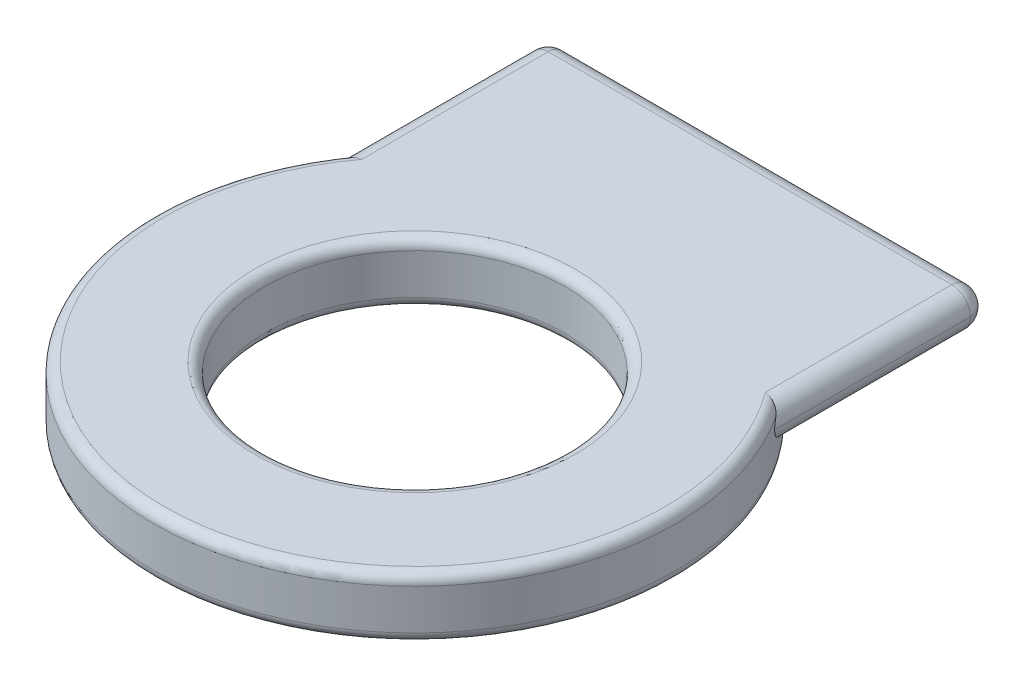
ISO-10303-21;
HEADER;
FILE_DESCRIPTION(('STEP AP214'),'2;1');
FILE_NAME('part.step','',(''),(''),'','','');
FILE_SCHEMA(('AUTOMOTIVE_DESIGN { 1 0 10303 214 1 1 1 1 }'));
ENDSEC;
DATA;
#1=APPLICATION_CONTEXT('core data for automotive mechanical design processes');
#2=APPLICATION_PROTOCOL_DEFINITION('international standard','automotive_design',2000,#1);
#3=PRODUCT_CONTEXT('',#1,'mechanical');
#4=PRODUCT('Part','Part','',(#3));
#5=PRODUCT_RELATED_PRODUCT_CATEGORY('part','',(#4));
#6=PRODUCT_DEFINITION_FORMATION('','',#4);
#7=PRODUCT_DEFINITION_CONTEXT('part definition',#1,'design');
#8=PRODUCT_DEFINITION('design','',#6,#7);
#9=PRODUCT_DEFINITION_SHAPE('','',#8);
#10=(LENGTH_UNIT() NAMED_UNIT(*) SI_UNIT(.MILLI.,.METRE.));
#11=(NAMED_UNIT(*) PLANE_ANGLE_UNIT() SI_UNIT($,.RADIAN.));
#12=(NAMED_UNIT(*) SI_UNIT($,.STERADIAN.) SOLID_ANGLE_UNIT());
#13=UNCERTAINTY_MEASURE_WITH_UNIT(LENGTH_MEASURE(1.E-05),#10,'distance_accuracy_value','');
#14=(GEOMETRIC_REPRESENTATION_CONTEXT(3) GLOBAL_UNCERTAINTY_ASSIGNED_CONTEXT((#13)) GLOBAL_UNIT_ASSIGNED_CONTEXT((#10,
#11,#12)) REPRESENTATION_CONTEXT('',''));
#15=CARTESIAN_POINT('',(0.,0.,0.));
#16=DIRECTION('',(0.,0.,1.));
#17=DIRECTION('',(1.,0.,0.));
#18=AXIS2_PLACEMENT_3D('',#15,#16,#17);
#19=CARTESIAN_POINT('',(0.,7.35,0.));
#20=DIRECTION('',(0.,-1.,0.));
#21=DIRECTION('',(0.,0.,-1.));
#22=AXIS2_PLACEMENT_3D('',#19,#20,#21);
#23=PLANE('',#22);
#24=CARTESIAN_POINT('',(43.61,7.35,0.));
#25=DIRECTION('',(0.,-1.,0.));
#26=DIRECTION('',(0.,0.,-1.));
#27=AXIS2_PLACEMENT_3D('',#24,#25,#26);
#28=CIRCLE('',#27,31.75);
#29=CARTESIAN_POINT('',(43.61,7.35,-31.75));
#30=VERTEX_POINT('',#29);
#31=EDGE_CURVE('E208',#30,#30,#28,.T.);
#32=ORIENTED_EDGE('',*,*,#31,.T.);
#33=EDGE_LOOP('',(#32));
#34=FACE_BOUND('',#33,.T.);
#35=CARTESIAN_POINT('',(43.61,7.35,0.));
#36=DIRECTION('',(0.,-1.,0.));
#37=DIRECTION('',(0.,0.,-1.));
#38=AXIS2_PLACEMENT_3D('',#35,#36,#37);
#39=CIRCLE('',#38,49.61);
#40=CARTESIAN_POINT('',(3.67499999999999,7.35,-29.433787982521));
#41=VERTEX_POINT('',#40);
#42=CARTESIAN_POINT('',(83.545,7.35,-29.4337879825211));
#43=VERTEX_POINT('',#42);
#44=EDGE_CURVE('E258',#41,#43,#39,.F.);
#45=ORIENTED_EDGE('',*,*,#44,.T.);
#46=DIRECTION('',(0.,0.,-1.));
#47=VECTOR('',#46,1.);
#48=CARTESIAN_POINT('',(83.545,7.35,0.));
#49=LINE('',#48,#47);
#50=CARTESIAN_POINT('',(83.545,7.35,-66.325));
#51=VERTEX_POINT('',#50);
#52=EDGE_CURVE('E57',#43,#51,#49,.T.);
#53=ORIENTED_EDGE('',*,*,#52,.T.);
#54=DIRECTION('',(-1.,0.,0.));
#55=VECTOR('',#54,1.);
#56=CARTESIAN_POINT('',(0.,7.35,-66.325));
#57=LINE('',#56,#55);
#58=CARTESIAN_POINT('',(3.67499999999997,7.35,-66.325));
#59=VERTEX_POINT('',#58);
#60=EDGE_CURVE('E278',#51,#59,#57,.T.);
#61=ORIENTED_EDGE('',*,*,#60,.T.);
#62=DIRECTION('',(0.,0.,1.));
#63=VECTOR('',#62,1.);
#64=CARTESIAN_POINT('',(3.675,7.35,0.));
#65=LINE('',#64,#63);
#66=EDGE_CURVE('E65',#59,#41,#65,.T.);
#67=ORIENTED_EDGE('',*,*,#66,.T.);
#68=EDGE_LOOP('',(#45,#53,#61,#67));
#69=FACE_BOUND('',#68,.T.);
#70=ADVANCED_FACE('F41',(#34,#69),#23,.F.);
#71=CARTESIAN_POINT('',(0.,0.,0.));
#72=DIRECTION('',(0.,-1.,0.));
#73=DIRECTION('',(0.,0.,-1.));
#74=AXIS2_PLACEMENT_3D('',#71,#72,#73);
#75=PLANE('',#74);
#76=DIRECTION('',(0.,0.,1.));
#77=VECTOR('',#76,1.);
#78=CARTESIAN_POINT('',(3.67499999999997,0.,-70.));
#79=LINE('',#78,#77);
#80=CARTESIAN_POINT('',(3.67499999999999,0.,-32.692321346151));
#81=VERTEX_POINT('',#80);
#82=CARTESIAN_POINT('',(3.67499999999997,0.,-66.325));
#83=VERTEX_POINT('',#82);
#84=EDGE_CURVE('E127',#81,#83,#79,.F.);
#85=ORIENTED_EDGE('',*,*,#84,.T.);
#86=DIRECTION('',(-1.,0.,0.));
#87=VECTOR('',#86,1.);
#88=CARTESIAN_POINT('',(83.545,0.,-66.325));
#89=LINE('',#88,#87);
#90=CARTESIAN_POINT('',(83.545,0.,-66.325));
#91=VERTEX_POINT('',#90);
#92=EDGE_CURVE('E309',#83,#91,#89,.F.);
#93=ORIENTED_EDGE('',*,*,#92,.T.);
#94=DIRECTION('',(0.,0.,-1.));
#95=VECTOR('',#94,1.);
#96=CARTESIAN_POINT('',(83.545,0.,-27.6));
#97=LINE('',#96,#95);
#98=CARTESIAN_POINT('',(83.545,0.,-32.692321346151));
#99=VERTEX_POINT('',#98);
#100=EDGE_CURVE('E130',#91,#99,#97,.F.);
#101=ORIENTED_EDGE('',*,*,#100,.T.);
#102=CARTESIAN_POINT('',(43.61,0.,0.));
#103=DIRECTION('',(0.,-1.,0.));
#104=DIRECTION('',(0.,0.,-1.));
#105=AXIS2_PLACEMENT_3D('',#102,#103,#104);
#106=CIRCLE('',#105,51.61);
#107=EDGE_CURVE('E114',#81,#99,#106,.T.);
#108=ORIENTED_EDGE('',*,*,#107,.F.);
#109=EDGE_LOOP('',(#85,#93,#101,#108));
#110=FACE_BOUND('',#109,.T.);
#111=ADVANCED_FACE('F126',(#110),#75,.T.);
#112=CARTESIAN_POINT('',(43.61,-4.65,0.));
#113=DIRECTION('',(0.,1.,0.));
#114=DIRECTION('',(0.,0.,1.));
#115=AXIS2_PLACEMENT_3D('',#112,#113,#114);
#116=CYLINDRICAL_SURFACE('',#115,51.61);
#117=CARTESIAN_POINT('',(43.61,-2.65,0.));
#118=DIRECTION('',(0.,1.,0.));
#119=DIRECTION('',(0.,0.,1.));
#120=AXIS2_PLACEMENT_3D('',#117,#118,#119);
#121=CIRCLE('',#120,51.61);
#122=CARTESIAN_POINT('',(43.61,-2.65,51.61));
#123=VERTEX_POINT('',#122);
#124=EDGE_CURVE('E271',#123,#123,#121,.T.);
#125=ORIENTED_EDGE('',*,*,#124,.T.);
#126=EDGE_LOOP('',(#125));
#127=FACE_BOUND('',#126,.T.);
#128=CARTESIAN_POINT('',(87.22,3.675,-27.6));
#129=CARTESIAN_POINT('',(87.2200120697274,3.73447058799168,-27.5999793407501));
#130=CARTESIAN_POINT('',(87.218556809487,3.7939277267955,-27.6022803186823));
#131=CARTESIAN_POINT('',(87.2128056210447,3.91229933152256,-27.6113653047313));
#132=CARTESIAN_POINT('',(87.2085126739399,3.97121430122931,-27.6181446081936));
#133=CARTESIAN_POINT('',(87.1972389785271,4.08750145547175,-27.6359331503886));
#134=CARTESIAN_POINT('',(87.1902867960608,4.14488332951717,-27.6468974309995));
#135=CARTESIAN_POINT('',(87.1738550365268,4.25837855794498,-27.6727821077687));
#136=CARTESIAN_POINT('',(87.1643746744983,4.31449151246753,-27.6877037326134));
#137=CARTESIAN_POINT('',(87.1273213842497,4.50688027331255,-27.7459414080385));
#138=CARTESIAN_POINT('',(87.0936953669759,4.6392486954479,-27.7986631399961));
#139=CARTESIAN_POINT('',(87.01504809175,4.89243449623341,-27.9213032975344));
#140=CARTESIAN_POINT('',(86.9699763162241,5.0131973067111,-27.9912979198964));
#141=CARTESIAN_POINT('',(86.8826484124497,5.21608170471932,-28.1260537318889));
#142=CARTESIAN_POINT('',(86.8421460567324,5.30068623596741,-28.1882901979503));
#143=CARTESIAN_POINT('',(86.7569522734654,5.46312965480362,-28.3185215300211));
#144=CARTESIAN_POINT('',(86.7122585299747,5.54096475563591,-28.386519577552));
#145=CARTESIAN_POINT('',(86.6193718175866,5.69034309299091,-28.527059811735));
#146=CARTESIAN_POINT('',(86.5711746472329,5.76187853964751,-28.5996074396383));
#147=CARTESIAN_POINT('',(86.4718583278312,5.89902605179465,-28.7482382999627));
#148=CARTESIAN_POINT('',(86.4207381153155,5.96463593875168,-28.8243228172758));
#149=CARTESIAN_POINT('',(86.2788117330235,6.13497963625819,-29.0342920338063));
#150=CARTESIAN_POINT('',(86.1855978771221,6.23441807257464,-29.1708611999369));
#151=CARTESIAN_POINT('',(85.9933286247488,6.41891362274059,-29.4495209871749));
#152=CARTESIAN_POINT('',(85.8942692705971,6.50396083881976,-29.5916153263626));
#153=CARTESIAN_POINT('',(85.6910623357859,6.66106227478908,-29.8798839242408));
#154=CARTESIAN_POINT('',(85.5869030778314,6.73308471661691,-30.0260671828873));
#155=CARTESIAN_POINT('',(85.3744013910541,6.86475504703722,-30.3209486990939));
#156=CARTESIAN_POINT('',(85.266058219993,6.92440072788308,-30.4696474002471));
#157=CARTESIAN_POINT('',(85.0288955191624,7.04006241532003,-30.7914435172894));
#158=CARTESIAN_POINT('',(84.8994758237081,7.09413286651806,-30.9647988577494));
#159=CARTESIAN_POINT('',(84.6364536872602,7.18695138060348,-31.3124533998675));
#160=CARTESIAN_POINT('',(84.5028505675109,7.22569694299828,-31.4867527508563));
#161=CARTESIAN_POINT('',(84.2334397841474,7.28755861186809,-31.8335663630081));
#162=CARTESIAN_POINT('',(84.0976681904939,7.31082915337742,-32.0060808111148));
#163=CARTESIAN_POINT('',(83.8918940847401,7.33424188472679,-32.2641166816434));
#164=CARTESIAN_POINT('',(83.822955792505,7.34013060295551,-32.349998843004));
#165=CARTESIAN_POINT('',(83.6844389138072,7.34800823864795,-32.5214328605851));
#166=CARTESIAN_POINT('',(83.6148602898839,7.34999692647697,-32.6069846970601));
#167=CARTESIAN_POINT('',(83.545,7.35,-32.692321346151));
#168=B_SPLINE_CURVE_WITH_KNOTS('',3,(#128,#129,#130,#131,#132,#133,#134,#135,#136,#137,#138,
#139,#140,#141,#142,#143,#144,#145,#146,#147,#148,#149,#150,#151,#152,#153,#154,#155,#156,#157,
#158,#159,#160,#161,#162,#163,#164,#165,#166,#167),.UNSPECIFIED.,.F.,.F.,(4,2,2,2,2,2,2,2,2,2,2,
2,2,2,2,2,2,2,2,4),(0.,0.178327623345856,0.356468203913899,0.53274660494184,0.709079801544966,
1.14564245880431,1.58416649635373,1.92141310778793,2.25884717443795,2.59669280350635,
2.93466214023832,3.51258605357865,4.09090584103518,4.67061812693129,5.25043373224296,
5.91880120675938,6.58727769082131,7.24897869854275,7.57977379849645,7.91058837515793),.UNSPECIFIED.);
#169=CARTESIAN_POINT('',(87.22,3.675,-27.6));
#170=VERTEX_POINT('',#169);
#171=CARTESIAN_POINT('',(86.8160854467592,5.35,-28.2281115267625));
#172=VERTEX_POINT('',#171);
#173=EDGE_CURVE('E178',#170,#172,#168,.T.);
#174=ORIENTED_EDGE('',*,*,#173,.T.);
#175=CARTESIAN_POINT('',(43.61,5.35,0.));
#176=DIRECTION('',(0.,-1.,0.));
#177=DIRECTION('',(0.,0.,-1.));
#178=AXIS2_PLACEMENT_3D('',#175,#176,#177);
#179=CIRCLE('',#178,51.61);
#180=CARTESIAN_POINT('',(0.403914553240769,5.35000000000001,-28.2281115267625));
#181=VERTEX_POINT('',#180);
#182=EDGE_CURVE('E275',#172,#181,#179,.T.);
#183=ORIENTED_EDGE('',*,*,#182,.T.);
#184=CARTESIAN_POINT('',(3.67499999999999,7.35,-32.692321346151));
#185=CARTESIAN_POINT('',(3.59227382574307,7.3499939535197,-32.5912689715995));
#186=CARTESIAN_POINT('',(3.50994538376433,7.34720722765317,-32.4899176345258));
#187=CARTESIAN_POINT('',(3.34620752456578,7.33618319214363,-32.2867794148593));
#188=CARTESIAN_POINT('',(3.26479805097582,7.32794621869075,-32.1849925595156));
#189=CARTESIAN_POINT('',(3.02197369560021,7.29520606536632,-31.8790214602955));
#190=CARTESIAN_POINT('',(2.86211102916241,7.2626740497858,-31.6744076908517));
#191=CARTESIAN_POINT('',(2.54600026977406,7.17616021901823,-31.2635242349988));
#192=CARTESIAN_POINT('',(2.38980625648028,7.12196125408952,-31.057259159301));
#193=CARTESIAN_POINT('',(2.08383358953764,6.9918433155668,-30.6469407090845));
#194=CARTESIAN_POINT('',(1.93405093997804,6.91593810395137,-30.4428860179685));
#195=CARTESIAN_POINT('',(1.70031947815462,6.77608176243416,-30.1196494402313));
#196=CARTESIAN_POINT('',(1.6139216066415,6.71942076155757,-29.9990499444419));
#197=CARTESIAN_POINT('',(1.44425367722334,6.59738245334317,-29.7600971416972));
#198=CARTESIAN_POINT('',(1.36098289697858,6.53200717502454,-29.6417433191687));
#199=CARTESIAN_POINT('',(1.19821946854505,6.39210782869622,-29.4083857581548));
#200=CARTESIAN_POINT('',(1.11871797732054,6.31760681072198,-29.2933744513592));
#201=CARTESIAN_POINT('',(0.963939034385889,6.1585611398075,-29.0675819227294));
#202=CARTESIAN_POINT('',(0.888659992485902,6.0740203058008,-28.9567991135182));
#203=CARTESIAN_POINT('',(0.721774258347508,5.86739212624301,-28.7092400772864));
#204=CARTESIAN_POINT('',(0.631864063188494,5.74156913352338,-28.5743834059908));
#205=CARTESIAN_POINT('',(0.463462497142845,5.4686847752141,-28.3194565515356));
#206=CARTESIAN_POINT('',(0.384960517493055,5.32164339804608,-28.199372646999));
#207=CARTESIAN_POINT('',(0.265580898717908,5.05201534191171,-28.0153823980677));
#208=CARTESIAN_POINT('',(0.220498196525729,4.93543958119461,-27.9454588765151));
#209=CARTESIAN_POINT('',(0.140933883058339,4.69105320708348,-27.8215347564378));
#210=CARTESIAN_POINT('',(0.106407936465446,4.5632925611308,-27.7674676059867));
#211=CARTESIAN_POINT('',(0.0660062926179986,4.37108328965644,-27.7040297010912));
#212=CARTESIAN_POINT('',(0.0548088173734166,4.31039231144217,-27.6864181883946));
#213=CARTESIAN_POINT('',(0.0353644245064966,4.18739488418497,-27.6558051959316));
#214=CARTESIAN_POINT('',(0.0271165421682486,4.12508897049849,-27.6428022088788));
#215=CARTESIAN_POINT('',(0.0137095031947962,3.99852365570931,-27.6216531749139));
#216=CARTESIAN_POINT('',(0.00858975528205809,3.93424963146483,-27.6135691022808));
#217=CARTESIAN_POINT('',(0.00172416212694252,3.80499104970251,-27.6027242667184));
#218=CARTESIAN_POINT('',(-1.71293237627876E-05,3.74000565173865,-27.599970688727));
#219=CARTESIAN_POINT('',(0.,3.675,-27.6));
#220=B_SPLINE_CURVE_WITH_KNOTS('',3,(#184,#185,#186,#187,#188,#189,#190,#191,#192,#193,#194,
#195,#196,#197,#198,#199,#200,#201,#202,#203,#204,#205,#206,#207,#208,#209,#210,#211,#212,#213,
#214,#215,#216,#217,#218,#219),.UNSPECIFIED.,.F.,.F.,(4,2,2,2,2,2,2,2,2,2,2,2,2,2,2,2,2,4),(0.,
0.391717803066449,0.783411445874936,1.56749822702151,2.35964857963435,3.15129781024117,
3.62747625438617,4.10354401890359,4.57843319824753,5.05314231492132,5.66724594229624,
6.28077479522588,6.70915646987603,7.13571353992119,7.32804224004372,7.52030797804853,
7.71494848828474,7.90985117098358),.UNSPECIFIED.);
#221=CARTESIAN_POINT('',(0.,3.675,-27.6));
#222=VERTEX_POINT('',#221);
#223=EDGE_CURVE('E116',#181,#222,#220,.T.);
#224=ORIENTED_EDGE('',*,*,#223,.T.);
#225=CARTESIAN_POINT('',(0.,3.675,-27.6));
#226=CARTESIAN_POINT('',(-1.20697273900106E-05,3.61552941200832,-27.5999793407501));
#227=CARTESIAN_POINT('',(0.00144319051303174,3.5560722732045,-27.6022803186823));
#228=CARTESIAN_POINT('',(0.00719437895523829,3.43770066847744,-27.6113653047313));
#229=CARTESIAN_POINT('',(0.0114873260601244,3.37878569877069,-27.6181446081936));
#230=CARTESIAN_POINT('',(0.0227610214728344,3.26249854452825,-27.6359331503885));
#231=CARTESIAN_POINT('',(0.0297132039391346,3.20511667048283,-27.6468974309994));
#232=CARTESIAN_POINT('',(0.0461449634731991,3.09162144205502,-27.6727821077687));
#233=CARTESIAN_POINT('',(0.0556253255017037,3.03550848753247,-27.6877037326134));
#234=CARTESIAN_POINT('',(0.0926786157502507,2.84311972668745,-27.7459414080385));
#235=CARTESIAN_POINT('',(0.12630463302411,2.7107513045521,-27.7986631399961));
#236=CARTESIAN_POINT('',(0.20495190825003,2.45756550376658,-27.9213032975344));
#237=CARTESIAN_POINT('',(0.25002368377592,2.3368026932889,-27.9912979198963));
#238=CARTESIAN_POINT('',(0.337351587550319,2.13391829528068,-28.1260537318889));
#239=CARTESIAN_POINT('',(0.377853943267574,2.04931376403259,-28.1882901979503));
#240=CARTESIAN_POINT('',(0.463047726534623,1.88687034519637,-28.3185215300211));
#241=CARTESIAN_POINT('',(0.507741470025302,1.80903524436408,-28.3865195775519));
#242=CARTESIAN_POINT('',(0.600628182413353,1.65965690700908,-28.527059811735));
#243=CARTESIAN_POINT('',(0.648825352767092,1.58812146035248,-28.5996074396383));
#244=CARTESIAN_POINT('',(0.748141672168754,1.45097394820534,-28.7482382999627));
#245=CARTESIAN_POINT('',(0.799261884684462,1.38536406124831,-28.8243228172758));
#246=CARTESIAN_POINT('',(0.941188266976504,1.21502036374179,-29.0342920338063));
#247=CARTESIAN_POINT('',(1.03440212287789,1.11558192742534,-29.1708611999369));
#248=CARTESIAN_POINT('',(1.22667137525119,0.931086377259395,-29.4495209871749));
#249=CARTESIAN_POINT('',(1.3257307294029,0.846039161180221,-29.5916153263626));
#250=CARTESIAN_POINT('',(1.52893766421413,0.688937725210902,-29.8798839242409));
#251=CARTESIAN_POINT('',(1.63309692216865,0.616915283383067,-30.0260671828873));
#252=CARTESIAN_POINT('',(1.84559860894587,0.485244952962758,-30.3209486990939));
#253=CARTESIAN_POINT('',(1.95394178000704,0.425599272116901,-30.4696474002471));
#254=CARTESIAN_POINT('',(2.19110448083764,0.309937584679953,-30.7914435172894));
#255=CARTESIAN_POINT('',(2.32052417629193,0.255867133481927,-30.9647988577494));
#256=CARTESIAN_POINT('',(2.58354631273984,0.163048619396511,-31.3124533998676));
#257=CARTESIAN_POINT('',(2.71714943248911,0.124303057001712,-31.4867527508563));
#258=CARTESIAN_POINT('',(2.98656021585262,0.0624413881319125,-31.8335663630081));
#259=CARTESIAN_POINT('',(3.12233180950609,0.0391708466225755,-32.0060808111148));
#260=CARTESIAN_POINT('',(3.32810591525992,0.0157581152732105,-32.2641166816434));
#261=CARTESIAN_POINT('',(3.39704420749496,0.0098693970444903,-32.349998843004));
#262=CARTESIAN_POINT('',(3.53556108619277,0.00199176135205103,-32.5214328605851));
#263=CARTESIAN_POINT('',(3.60513971011609,3.07352303006731E-06,-32.6069846970601));
#264=CARTESIAN_POINT('',(3.67499999999999,0.,-32.692321346151));
#265=B_SPLINE_CURVE_WITH_KNOTS('',3,(#225,#226,#227,#228,#229,#230,#231,#232,#233,#234,#235,
#236,#237,#238,#239,#240,#241,#242,#243,#244,#245,#246,#247,#248,#249,#250,#251,#252,#253,#254,
#255,#256,#257,#258,#259,#260,#261,#262,#263,#264),.UNSPECIFIED.,.F.,.F.,(4,2,2,2,2,2,2,2,2,2,2,
2,2,2,2,2,2,2,2,4),(0.,0.178327623345857,0.356468203913899,0.532746604941839,0.709079801544968,
1.14564245880432,1.58416649635373,1.92141310778794,2.25884717443796,2.59669280350636,
2.93466214023834,3.5125860535787,4.09090584103524,4.67061812693135,5.25043373224302,
5.91880120675942,6.58727769082133,7.24897869854277,7.57977379849646,7.91058837515794),.UNSPECIFIED.);
#266=EDGE_CURVE('E109',#222,#81,#265,.T.);
#267=ORIENTED_EDGE('',*,*,#266,.T.);
#268=ORIENTED_EDGE('',*,*,#107,.T.);
#269=CARTESIAN_POINT('',(83.545,0.,-32.692321346151));
#270=CARTESIAN_POINT('',(83.6277261742569,6.04648029819773E-06,-32.5912689715995));
#271=CARTESIAN_POINT('',(83.7100546162357,0.00279277234682455,-32.4899176345258));
#272=CARTESIAN_POINT('',(83.8737924754342,0.0138168078563718,-32.2867794148593));
#273=CARTESIAN_POINT('',(83.9552019490242,0.0220537813092535,-32.1849925595156));
#274=CARTESIAN_POINT('',(84.1980263043998,0.0547939346336789,-31.8790214602955));
#275=CARTESIAN_POINT('',(84.3578889708376,0.0873259502141974,-31.6744076908517));
#276=CARTESIAN_POINT('',(84.6739997302259,0.173839780981774,-31.2635242349988));
#277=CARTESIAN_POINT('',(84.8301937435197,0.228038745910485,-31.057259159301));
#278=CARTESIAN_POINT('',(85.1361664104624,0.358156684433202,-30.6469407090846));
#279=CARTESIAN_POINT('',(85.285949060022,0.434061896048637,-30.4428860179685));
#280=CARTESIAN_POINT('',(85.5196805218454,0.573918237565846,-30.1196494402313));
#281=CARTESIAN_POINT('',(85.6060783933585,0.630579238442443,-29.9990499444419));
#282=CARTESIAN_POINT('',(85.7757463227767,0.752617546656845,-29.7600971416972));
#283=CARTESIAN_POINT('',(85.8590171030214,0.81799282497548,-29.6417433191687));
#284=CARTESIAN_POINT('',(86.021780531455,0.95789217130379,-29.4083857581548));
#285=CARTESIAN_POINT('',(86.1012820226795,1.03239318927803,-29.2933744513592));
#286=CARTESIAN_POINT('',(86.2560609656141,1.19143886019251,-29.0675819227294));
#287=CARTESIAN_POINT('',(86.3313400075141,1.27597969419922,-28.9567991135182));
#288=CARTESIAN_POINT('',(86.4982257416525,1.48260787375701,-28.7092400772864));
#289=CARTESIAN_POINT('',(86.5881359368115,1.60843086647664,-28.5743834059908));
#290=CARTESIAN_POINT('',(86.7565375028572,1.88131522478591,-28.3194565515356));
#291=CARTESIAN_POINT('',(86.8350394825069,2.02835660195393,-28.199372646999));
#292=CARTESIAN_POINT('',(86.9544191012821,2.2979846580883,-28.0153823980678));
#293=CARTESIAN_POINT('',(86.9995018034742,2.4145604188054,-27.9454588765151));
#294=CARTESIAN_POINT('',(87.0790661169416,2.65894679291652,-27.8215347564378));
#295=CARTESIAN_POINT('',(87.1135920635345,2.7867074388692,-27.7674676059867));
#296=CARTESIAN_POINT('',(87.153993707382,2.97891671034358,-27.7040297010913));
#297=CARTESIAN_POINT('',(87.1651911826266,3.03960768855785,-27.6864181883946));
#298=CARTESIAN_POINT('',(87.1846355754935,3.16260511581504,-27.6558051959316));
#299=CARTESIAN_POINT('',(87.1928834578317,3.22491102950151,-27.6428022088788));
#300=CARTESIAN_POINT('',(87.2062904968052,3.35147634429069,-27.6216531749139));
#301=CARTESIAN_POINT('',(87.2114102447179,3.41575036853517,-27.6135691022808));
#302=CARTESIAN_POINT('',(87.2182758378731,3.54500895029749,-27.6027242667184));
#303=CARTESIAN_POINT('',(87.2200171293238,3.60999434826135,-27.599970688727));
#304=CARTESIAN_POINT('',(87.22,3.675,-27.6));
#305=B_SPLINE_CURVE_WITH_KNOTS('',3,(#269,#270,#271,#272,#273,#274,#275,#276,#277,#278,#279,
#280,#281,#282,#283,#284,#285,#286,#287,#288,#289,#290,#291,#292,#293,#294,#295,#296,#297,#298,
#299,#300,#301,#302,#303,#304),.UNSPECIFIED.,.F.,.F.,(4,2,2,2,2,2,2,2,2,2,2,2,2,2,2,2,2,4),(0.,
0.391717803066445,0.783411445874927,1.56749822702151,2.35964857963435,3.15129781024119,
3.6274762543862,4.10354401890361,4.57843319824756,5.05314231492134,5.66724594229625,
6.28077479522589,6.70915646987603,7.1357135399212,7.32804224004373,7.52030797804853,
7.71494848828474,7.90985117098358),.UNSPECIFIED.);
#306=EDGE_CURVE('E122',#99,#170,#305,.T.);
#307=ORIENTED_EDGE('',*,*,#306,.T.);
#308=EDGE_LOOP('',(#174,#183,#224,#267,#268,#307));
#309=FACE_BOUND('',#308,.T.);
#310=ADVANCED_FACE('F112',(#127,#309),#116,.T.);
#311=CARTESIAN_POINT('',(43.61,-4.65,0.));
#312=DIRECTION('',(0.,1.,0.));
#313=DIRECTION('',(0.,0.,1.));
#314=AXIS2_PLACEMENT_3D('',#311,#312,#313);
#315=PLANE('',#314);
#316=CARTESIAN_POINT('',(43.61,-4.65,0.));
#317=DIRECTION('',(0.,1.,0.));
#318=DIRECTION('',(0.,0.,1.));
#319=AXIS2_PLACEMENT_3D('',#316,#317,#318);
#320=CIRCLE('',#319,31.75);
#321=CARTESIAN_POINT('',(43.61,-4.65,31.75));
#322=VERTEX_POINT('',#321);
#323=EDGE_CURVE('E50',#322,#322,#320,.T.);
#324=ORIENTED_EDGE('',*,*,#323,.T.);
#325=EDGE_LOOP('',(#324));
#326=FACE_BOUND('',#325,.T.);
#327=CARTESIAN_POINT('',(43.61,-4.65,0.));
#328=DIRECTION('',(0.,1.,0.));
#329=DIRECTION('',(0.,0.,1.));
#330=AXIS2_PLACEMENT_3D('',#327,#328,#329);
#331=CIRCLE('',#330,49.61);
#332=CARTESIAN_POINT('',(43.61,-4.65,49.61));
#333=VERTEX_POINT('',#332);
#334=EDGE_CURVE('E265',#333,#333,#331,.F.);
#335=ORIENTED_EDGE('',*,*,#334,.T.);
#336=EDGE_LOOP('',(#335));
#337=FACE_BOUND('',#336,.T.);
#338=ADVANCED_FACE('F164',(#326,#337),#315,.F.);
#339=CARTESIAN_POINT('',(43.61,-4.65,0.));
#340=DIRECTION('',(0.,1.,0.));
#341=DIRECTION('',(0.,0.,1.));
#342=AXIS2_PLACEMENT_3D('',#339,#340,#341);
#343=CYLINDRICAL_SURFACE('',#342,29.75);
#344=CARTESIAN_POINT('',(43.61,-2.65,0.));
#345=DIRECTION('',(0.,1.,0.));
#346=DIRECTION('',(0.,0.,1.));
#347=AXIS2_PLACEMENT_3D('',#344,#345,#346);
#348=CIRCLE('',#347,29.75);
#349=CARTESIAN_POINT('',(43.61,-2.65,29.75));
#350=VERTEX_POINT('',#349);
#351=EDGE_CURVE('E11',#350,#350,#348,.F.);
#352=ORIENTED_EDGE('',*,*,#351,.T.);
#353=EDGE_LOOP('',(#352));
#354=FACE_BOUND('',#353,.T.);
#355=CARTESIAN_POINT('',(43.61,5.35,0.));
#356=DIRECTION('',(0.,-1.,0.));
#357=DIRECTION('',(0.,0.,-1.));
#358=AXIS2_PLACEMENT_3D('',#355,#356,#357);
#359=CIRCLE('',#358,29.75);
#360=CARTESIAN_POINT('',(43.61,5.35,-29.75));
#361=VERTEX_POINT('',#360);
#362=EDGE_CURVE('E261',#361,#361,#359,.F.);
#363=ORIENTED_EDGE('',*,*,#362,.T.);
#364=EDGE_LOOP('',(#363));
#365=FACE_BOUND('',#364,.T.);
#366=ADVANCED_FACE('F166',(#354,#365),#343,.F.);
#367=CARTESIAN_POINT('',(3.675,3.675,0.));
#368=DIRECTION('',(0.,0.,-1.));
#369=DIRECTION('',(-1.,0.,0.));
#370=AXIS2_PLACEMENT_3D('',#367,#368,#369);
#371=CYLINDRICAL_SURFACE('',#370,3.675);
#372=DIRECTION('',(0.,0.,1.));
#373=VECTOR('',#372,1.);
#374=CARTESIAN_POINT('',(0.,3.675,-27.6));
#375=LINE('',#374,#373);
#376=CARTESIAN_POINT('',(0.,3.675,-66.325));
#377=VERTEX_POINT('',#376);
#378=EDGE_CURVE('E133',#377,#222,#375,.T.);
#379=ORIENTED_EDGE('',*,*,#378,.F.);
#380=CARTESIAN_POINT('',(3.67499999999997,3.675,-66.325));
#381=DIRECTION('',(0.,0.,-1.));
#382=DIRECTION('',(-1.,0.,0.));
#383=AXIS2_PLACEMENT_3D('',#380,#381,#382);
#384=CIRCLE('',#383,3.675);
#385=EDGE_CURVE('E137',#377,#83,#384,.F.);
#386=ORIENTED_EDGE('',*,*,#385,.T.);
#387=ORIENTED_EDGE('',*,*,#84,.F.);
#388=ORIENTED_EDGE('',*,*,#266,.F.);
#389=EDGE_LOOP('',(#379,#386,#387,#388));
#390=FACE_BOUND('',#389,.T.);
#391=ADVANCED_FACE('F135',(#390),#371,.T.);
#392=CARTESIAN_POINT('',(3.675,3.675,0.));
#393=DIRECTION('',(0.,0.,1.));
#394=DIRECTION('',(1.,0.,0.));
#395=AXIS2_PLACEMENT_3D('',#392,#393,#394);
#396=CYLINDRICAL_SURFACE('',#395,3.675);
#397=ORIENTED_EDGE('',*,*,#66,.F.);
#398=CARTESIAN_POINT('',(3.67499999999997,3.675,-66.325));
#399=DIRECTION('',(0.,0.,1.));
#400=DIRECTION('',(1.,0.,0.));
#401=AXIS2_PLACEMENT_3D('',#398,#399,#400);
#402=CIRCLE('',#401,3.675);
#403=EDGE_CURVE('E312',#59,#377,#402,.T.);
#404=ORIENTED_EDGE('',*,*,#403,.T.);
#405=ORIENTED_EDGE('',*,*,#378,.T.);
#406=ORIENTED_EDGE('',*,*,#223,.F.);
#407=CARTESIAN_POINT('',(0.403914553240769,5.35,-28.2281115267625));
#408=CARTESIAN_POINT('',(0.435478592487258,5.41166843994323,-28.2764531672922));
#409=CARTESIAN_POINT('',(0.469396614691892,5.47358183887079,-28.3229476207205));
#410=CARTESIAN_POINT('',(0.541990061714706,5.59723542916085,-28.4122945219835));
#411=CARTESIAN_POINT('',(0.580665015896002,5.65897563704115,-28.4551473294038));
#412=CARTESIAN_POINT('',(0.662820510480497,5.78162101645552,-28.5372653731954));
#413=CARTESIAN_POINT('',(0.706300175451741,5.8425263378426,-28.5765312607401));
#414=CARTESIAN_POINT('',(0.798025514889235,5.96287396580632,-28.6515938567353));
#415=CARTESIAN_POINT('',(0.846271579564495,6.0223161521026,-28.6873902806766));
#416=CARTESIAN_POINT('',(0.956758601716215,6.14990614496263,-28.7619533978183));
#417=CARTESIAN_POINT('',(1.01993909937953,6.21763598435031,-28.8000490236448));
#418=CARTESIAN_POINT('',(1.15254979356268,6.34924802238274,-28.8718592028956));
#419=CARTESIAN_POINT('',(1.22198269651554,6.41312853463304,-28.9055718435091));
#420=CARTESIAN_POINT('',(1.36662878350814,6.53612850210965,-28.9689148746798));
#421=CARTESIAN_POINT('',(1.4418396145523,6.59524987556454,-28.9985469134304));
#422=CARTESIAN_POINT('',(1.59758559493438,6.70802191203763,-29.0541157677008));
#423=CARTESIAN_POINT('',(1.67812266346346,6.76167058519128,-29.0800512405072));
#424=CARTESIAN_POINT('',(1.84347041014587,6.86254655135056,-29.128468835783));
#425=CARTESIAN_POINT('',(1.92825565523887,6.90980696348616,-29.1509688544507));
#426=CARTESIAN_POINT('',(2.10187918665131,6.99770745373152,-29.1930784847291));
#427=CARTESIAN_POINT('',(2.19071756855662,7.03834737560565,-29.212688028127));
#428=CARTESIAN_POINT('',(2.37178975313652,7.11256319346225,-29.2494214945307));
#429=CARTESIAN_POINT('',(2.46402342191057,7.14613936766908,-29.2665455154271));
#430=CARTESIAN_POINT('',(2.65118408734162,7.20587480842697,-29.2987165824014));
#431=CARTESIAN_POINT('',(2.74611052968728,7.23203558943299,-29.3137640522531));
#432=CARTESIAN_POINT('',(2.97544065344989,7.28539945647628,-29.3477529542152));
#433=CARTESIAN_POINT('',(3.11080212919512,7.30902997714543,-29.3659243075781));
#434=CARTESIAN_POINT('',(3.38337020195895,7.3409740696313,-29.4001649838825));
#435=CARTESIAN_POINT('',(3.52057304523761,7.34931509588038,-29.4162380263203));
#436=CARTESIAN_POINT('',(3.66350308216853,7.34998654144318,-29.4324836940073));
#437=CARTESIAN_POINT('',(3.66925159894046,7.3500000312925,-29.4331362401001));
#438=CARTESIAN_POINT('',(3.675,7.35,-29.433787982521));
#439=B_SPLINE_CURVE_WITH_KNOTS('',3,(#407,#408,#409,#410,#411,#412,#413,#414,#415,#416,#417,
#418,#419,#420,#421,#422,#423,#424,#425,#426,#427,#428,#429,#430,#431,#432,#433,#434,#435,#436,
#437,#438),.UNSPECIFIED.,.F.,.F.,(4,2,2,2,2,2,2,2,2,2,2,2,2,2,2,4),(0.,0.253377801586797,
0.50673055485196,0.760037222401726,1.01336464452231,1.31344489914542,1.61365567750652,
1.91374484000009,2.21394272837951,2.51251913334062,2.81110258332619,3.10967427061124,
3.40818493622289,3.82311490848506,4.2372990831537,4.25465536305802),.UNSPECIFIED.);
#440=EDGE_CURVE('E207',#181,#41,#439,.T.);
#441=ORIENTED_EDGE('',*,*,#440,.T.);
#442=EDGE_LOOP('',(#397,#404,#405,#406,#441));
#443=FACE_BOUND('',#442,.T.);
#444=ADVANCED_FACE('F157',(#443),#396,.T.);
#445=CARTESIAN_POINT('',(83.545,3.675,0.));
#446=DIRECTION('',(0.,0.,-1.));
#447=DIRECTION('',(-1.,0.,0.));
#448=AXIS2_PLACEMENT_3D('',#445,#446,#447);
#449=CYLINDRICAL_SURFACE('',#448,3.675);
#450=DIRECTION('',(0.,0.,-1.));
#451=VECTOR('',#450,1.);
#452=CARTESIAN_POINT('',(87.22,3.675,0.));
#453=LINE('',#452,#451);
#454=CARTESIAN_POINT('',(87.22,3.675,-66.325));
#455=VERTEX_POINT('',#454);
#456=EDGE_CURVE('E283',#455,#170,#453,.F.);
#457=ORIENTED_EDGE('',*,*,#456,.F.);
#458=CARTESIAN_POINT('',(83.545,3.675,-66.325));
#459=DIRECTION('',(0.,0.,-1.));
#460=DIRECTION('',(-1.,0.,0.));
#461=AXIS2_PLACEMENT_3D('',#458,#459,#460);
#462=CIRCLE('',#461,3.675);
#463=EDGE_CURVE('E320',#455,#51,#462,.F.);
#464=ORIENTED_EDGE('',*,*,#463,.T.);
#465=ORIENTED_EDGE('',*,*,#52,.F.);
#466=CARTESIAN_POINT('',(86.8160854467592,5.35,-28.2281115267625));
#467=CARTESIAN_POINT('',(86.7845214075127,5.41166843994322,-28.2764531672922));
#468=CARTESIAN_POINT('',(86.7506033853081,5.47358183887079,-28.3229476207205));
#469=CARTESIAN_POINT('',(86.6780099382853,5.59723542916084,-28.4122945219835));
#470=CARTESIAN_POINT('',(86.639334984104,5.65897563704114,-28.4551473294038));
#471=CARTESIAN_POINT('',(86.5571794895195,5.78162101645552,-28.5372653731955));
#472=CARTESIAN_POINT('',(86.5136998245483,5.84252633784259,-28.5765312607401));
#473=CARTESIAN_POINT('',(86.4219744851107,5.96287396580631,-28.6515938567353));
#474=CARTESIAN_POINT('',(86.3737284204355,6.0223161521026,-28.6873902806766));
#475=CARTESIAN_POINT('',(86.2632413982838,6.14990614496262,-28.7619533978183));
#476=CARTESIAN_POINT('',(86.2000609006205,6.2176359843503,-28.8000490236448));
#477=CARTESIAN_POINT('',(86.0674502064373,6.34924802238273,-28.8718592028956));
#478=CARTESIAN_POINT('',(85.9980173034844,6.41312853463303,-28.9055718435091));
#479=CARTESIAN_POINT('',(85.8533712164919,6.53612850210964,-28.9689148746798));
#480=CARTESIAN_POINT('',(85.7781603854477,6.59524987556453,-28.9985469134304));
#481=CARTESIAN_POINT('',(85.6224144050656,6.70802191203762,-29.0541157677008));
#482=CARTESIAN_POINT('',(85.5418773365365,6.76167058519127,-29.0800512405072));
#483=CARTESIAN_POINT('',(85.3765295898541,6.86254655135055,-29.1284688357831));
#484=CARTESIAN_POINT('',(85.2917443447611,6.90980696348616,-29.1509688544508));
#485=CARTESIAN_POINT('',(85.1181208133487,6.99770745373152,-29.1930784847291));
#486=CARTESIAN_POINT('',(85.0292824314434,7.03834737560565,-29.212688028127));
#487=CARTESIAN_POINT('',(84.8482102468635,7.11256319346225,-29.2494214945307));
#488=CARTESIAN_POINT('',(84.7559765780894,7.14613936766908,-29.2665455154272));
#489=CARTESIAN_POINT('',(84.5688159126583,7.20587480842698,-29.2987165824014));
#490=CARTESIAN_POINT('',(84.4738894703127,7.232035589433,-29.3137640522531));
#491=CARTESIAN_POINT('',(84.2445593465501,7.28539945647628,-29.3477529542153));
#492=CARTESIAN_POINT('',(84.1091978708048,7.30902997714543,-29.3659243075782));
#493=CARTESIAN_POINT('',(83.836629798041,7.3409740696313,-29.4001649838825));
#494=CARTESIAN_POINT('',(83.6994269547624,7.34931509588038,-29.4162380263202));
#495=CARTESIAN_POINT('',(83.5564969178315,7.34998654144318,-29.4324836940073));
#496=CARTESIAN_POINT('',(83.5507484010595,7.3500000312925,-29.4331362401001));
#497=CARTESIAN_POINT('',(83.545,7.35,-29.4337879825211));
#498=B_SPLINE_CURVE_WITH_KNOTS('',3,(#466,#467,#468,#469,#470,#471,#472,#473,#474,#475,#476,
#477,#478,#479,#480,#481,#482,#483,#484,#485,#486,#487,#488,#489,#490,#491,#492,#493,#494,#495,
#496,#497),.UNSPECIFIED.,.F.,.F.,(4,2,2,2,2,2,2,2,2,2,2,2,2,2,2,4),(0.,0.253377801586795,
0.506730554851964,0.760037222401725,1.01336464452231,1.31344489914541,1.61365567750652,
1.91374484000009,2.21394272837951,2.51251913334062,2.81110258332619,3.10967427061126,
3.40818493622292,3.82311490848506,4.23729908315368,4.25465536305802),.UNSPECIFIED.);
#499=EDGE_CURVE('E199',#43,#172,#498,.F.);
#500=ORIENTED_EDGE('',*,*,#499,.T.);
#501=ORIENTED_EDGE('',*,*,#173,.F.);
#502=EDGE_LOOP('',(#457,#464,#465,#500,#501));
#503=FACE_BOUND('',#502,.T.);
#504=ADVANCED_FACE('F189',(#503),#449,.T.);
#505=CARTESIAN_POINT('',(83.545,3.675,0.));
#506=DIRECTION('',(0.,0.,1.));
#507=DIRECTION('',(1.,0.,0.));
#508=AXIS2_PLACEMENT_3D('',#505,#506,#507);
#509=CYLINDRICAL_SURFACE('',#508,3.675);
#510=ORIENTED_EDGE('',*,*,#100,.F.);
#511=CARTESIAN_POINT('',(83.545,3.675,-66.325));
#512=DIRECTION('',(0.,0.,1.));
#513=DIRECTION('',(1.,0.,0.));
#514=AXIS2_PLACEMENT_3D('',#511,#512,#513);
#515=CIRCLE('',#514,3.675);
#516=EDGE_CURVE('E317',#91,#455,#515,.T.);
#517=ORIENTED_EDGE('',*,*,#516,.T.);
#518=ORIENTED_EDGE('',*,*,#456,.T.);
#519=ORIENTED_EDGE('',*,*,#306,.F.);
#520=EDGE_LOOP('',(#510,#517,#518,#519));
#521=FACE_BOUND('',#520,.T.);
#522=ADVANCED_FACE('F185',(#521),#509,.T.);
#523=CARTESIAN_POINT('',(3.67499999999997,3.675,-66.325));
#524=DIRECTION('',(0.,0.,1.));
#525=DIRECTION('',(1.,0.,0.));
#526=AXIS2_PLACEMENT_3D('',#523,#524,#525);
#527=SPHERICAL_SURFACE('',#526,3.675);
#528=CARTESIAN_POINT('',(3.67499999999997,3.675,-66.325));
#529=DIRECTION('',(1.,0.,0.));
#530=DIRECTION('',(0.,0.,-1.));
#531=AXIS2_PLACEMENT_3D('',#528,#529,#530);
#532=CIRCLE('',#531,3.675);
#533=CARTESIAN_POINT('',(3.67499999999997,3.675,-70.));
#534=VERTEX_POINT('',#533);
#535=EDGE_CURVE('E284',#83,#534,#532,.T.);
#536=ORIENTED_EDGE('',*,*,#535,.F.);
#537=ORIENTED_EDGE('',*,*,#385,.F.);
#538=CARTESIAN_POINT('',(3.67499999999997,3.675,-66.325));
#539=DIRECTION('',(0.,1.,0.));
#540=DIRECTION('',(0.,0.,1.));
#541=AXIS2_PLACEMENT_3D('',#538,#539,#540);
#542=CIRCLE('',#541,3.675);
#543=EDGE_CURVE('E279',#534,#377,#542,.T.);
#544=ORIENTED_EDGE('',*,*,#543,.F.);
#545=EDGE_LOOP('',(#536,#537,#544));
#546=FACE_BOUND('',#545,.T.);
#547=ADVANCED_FACE('F188',(#546),#527,.T.);
#548=CARTESIAN_POINT('',(3.67499999999997,3.675,-66.325));
#549=DIRECTION('',(0.,0.,1.));
#550=DIRECTION('',(1.,0.,0.));
#551=AXIS2_PLACEMENT_3D('',#548,#549,#550);
#552=SPHERICAL_SURFACE('',#551,3.675);
#553=ORIENTED_EDGE('',*,*,#543,.T.);
#554=ORIENTED_EDGE('',*,*,#403,.F.);
#555=CARTESIAN_POINT('',(3.67499999999997,3.675,-66.325));
#556=DIRECTION('',(1.,0.,0.));
#557=DIRECTION('',(0.,0.,-1.));
#558=AXIS2_PLACEMENT_3D('',#555,#556,#557);
#559=CIRCLE('',#558,3.675);
#560=EDGE_CURVE('E288',#534,#59,#559,.T.);
#561=ORIENTED_EDGE('',*,*,#560,.F.);
#562=EDGE_LOOP('',(#553,#554,#561));
#563=FACE_BOUND('',#562,.T.);
#564=ADVANCED_FACE('F230',(#563),#552,.T.);
#565=CARTESIAN_POINT('',(0.,3.675,-66.325));
#566=DIRECTION('',(1.,0.,0.));
#567=DIRECTION('',(0.,0.,-1.));
#568=AXIS2_PLACEMENT_3D('',#565,#566,#567);
#569=CYLINDRICAL_SURFACE('',#568,3.675);
#570=ORIENTED_EDGE('',*,*,#92,.F.);
#571=ORIENTED_EDGE('',*,*,#535,.T.);
#572=DIRECTION('',(-1.,0.,0.));
#573=VECTOR('',#572,1.);
#574=CARTESIAN_POINT('',(3.67499999999997,3.675,-70.));
#575=LINE('',#574,#573);
#576=CARTESIAN_POINT('',(83.545,3.675,-70.));
#577=VERTEX_POINT('',#576);
#578=EDGE_CURVE('E292',#577,#534,#575,.T.);
#579=ORIENTED_EDGE('',*,*,#578,.F.);
#580=CARTESIAN_POINT('',(83.545,3.675,-66.325));
#581=DIRECTION('',(1.,0.,0.));
#582=DIRECTION('',(0.,0.,-1.));
#583=AXIS2_PLACEMENT_3D('',#580,#581,#582);
#584=CIRCLE('',#583,3.675);
#585=EDGE_CURVE('E296',#91,#577,#584,.T.);
#586=ORIENTED_EDGE('',*,*,#585,.F.);
#587=EDGE_LOOP('',(#570,#571,#579,#586));
#588=FACE_BOUND('',#587,.T.);
#589=ADVANCED_FACE('F234',(#588),#569,.T.);
#590=CARTESIAN_POINT('',(0.,3.675,-66.325));
#591=DIRECTION('',(-1.,0.,0.));
#592=DIRECTION('',(0.,0.,1.));
#593=AXIS2_PLACEMENT_3D('',#590,#591,#592);
#594=CYLINDRICAL_SURFACE('',#593,3.675);
#595=ORIENTED_EDGE('',*,*,#560,.T.);
#596=ORIENTED_EDGE('',*,*,#60,.F.);
#597=CARTESIAN_POINT('',(83.545,3.675,-66.325));
#598=DIRECTION('',(1.,0.,0.));
#599=DIRECTION('',(0.,0.,-1.));
#600=AXIS2_PLACEMENT_3D('',#597,#598,#599);
#601=CIRCLE('',#600,3.675);
#602=EDGE_CURVE('E300',#577,#51,#601,.T.);
#603=ORIENTED_EDGE('',*,*,#602,.F.);
#604=ORIENTED_EDGE('',*,*,#578,.T.);
#605=EDGE_LOOP('',(#595,#596,#603,#604));
#606=FACE_BOUND('',#605,.T.);
#607=ADVANCED_FACE('F238',(#606),#594,.T.);
#608=CARTESIAN_POINT('',(83.545,3.675,-66.325));
#609=DIRECTION('',(0.,0.,1.));
#610=DIRECTION('',(1.,0.,0.));
#611=AXIS2_PLACEMENT_3D('',#608,#609,#610);
#612=SPHERICAL_SURFACE('',#611,3.675);
#613=ORIENTED_EDGE('',*,*,#516,.F.);
#614=ORIENTED_EDGE('',*,*,#585,.T.);
#615=CARTESIAN_POINT('',(83.545,3.675,-66.325));
#616=DIRECTION('',(0.,1.,0.));
#617=DIRECTION('',(0.,0.,1.));
#618=AXIS2_PLACEMENT_3D('',#615,#616,#617);
#619=CIRCLE('',#618,3.675);
#620=EDGE_CURVE('E303',#455,#577,#619,.T.);
#621=ORIENTED_EDGE('',*,*,#620,.F.);
#622=EDGE_LOOP('',(#613,#614,#621));
#623=FACE_BOUND('',#622,.T.);
#624=ADVANCED_FACE('F241',(#623),#612,.T.);
#625=CARTESIAN_POINT('',(83.545,3.675,-66.325));
#626=DIRECTION('',(0.,0.,1.));
#627=DIRECTION('',(1.,0.,0.));
#628=AXIS2_PLACEMENT_3D('',#625,#626,#627);
#629=SPHERICAL_SURFACE('',#628,3.675);
#630=ORIENTED_EDGE('',*,*,#602,.T.);
#631=ORIENTED_EDGE('',*,*,#463,.F.);
#632=ORIENTED_EDGE('',*,*,#620,.T.);
#633=EDGE_LOOP('',(#630,#631,#632));
#634=FACE_BOUND('',#633,.T.);
#635=ADVANCED_FACE('F195',(#634),#629,.T.);
#636=CARTESIAN_POINT('',(43.61,-2.65,0.));
#637=DIRECTION('',(0.,1.,0.));
#638=DIRECTION('',(0.,0.,1.));
#639=AXIS2_PLACEMENT_3D('',#636,#637,#638);
#640=TOROIDAL_SURFACE('',#639,49.61,2.);
#641=ORIENTED_EDGE('',*,*,#334,.F.);
#642=EDGE_LOOP('',(#641));
#643=FACE_BOUND('',#642,.T.);
#644=ORIENTED_EDGE('',*,*,#124,.F.);
#645=EDGE_LOOP('',(#644));
#646=FACE_BOUND('',#645,.T.);
#647=ADVANCED_FACE('F223',(#643,#646),#640,.T.);
#648=CARTESIAN_POINT('',(43.61,5.35,0.));
#649=DIRECTION('',(0.,-1.,0.));
#650=DIRECTION('',(0.,0.,-1.));
#651=AXIS2_PLACEMENT_3D('',#648,#649,#650);
#652=TOROIDAL_SURFACE('',#651,31.75,2.);
#653=ORIENTED_EDGE('',*,*,#31,.F.);
#654=EDGE_LOOP('',(#653));
#655=FACE_BOUND('',#654,.T.);
#656=ORIENTED_EDGE('',*,*,#362,.F.);
#657=EDGE_LOOP('',(#656));
#658=FACE_BOUND('',#657,.T.);
#659=ADVANCED_FACE('F218',(#655,#658),#652,.T.);
#660=CARTESIAN_POINT('',(43.61,5.35,0.));
#661=DIRECTION('',(0.,-1.,0.));
#662=DIRECTION('',(0.,0.,-1.));
#663=AXIS2_PLACEMENT_3D('',#660,#661,#662);
#664=TOROIDAL_SURFACE('',#663,49.61,2.);
#665=ORIENTED_EDGE('',*,*,#440,.F.);
#666=ORIENTED_EDGE('',*,*,#182,.F.);
#667=ORIENTED_EDGE('',*,*,#499,.F.);
#668=ORIENTED_EDGE('',*,*,#44,.F.);
#669=EDGE_LOOP('',(#665,#666,#667,#668));
#670=FACE_BOUND('',#669,.T.);
#671=ADVANCED_FACE('F214',(#670),#664,.T.);
#672=CARTESIAN_POINT('',(43.61,-2.65,0.));
#673=DIRECTION('',(0.,1.,0.));
#674=DIRECTION('',(0.,0.,1.));
#675=AXIS2_PLACEMENT_3D('',#672,#673,#674);
#676=TOROIDAL_SURFACE('',#675,31.75,2.);
#677=ORIENTED_EDGE('',*,*,#351,.F.);
#678=EDGE_LOOP('',(#677));
#679=FACE_BOUND('',#678,.T.);
#680=ORIENTED_EDGE('',*,*,#323,.F.);
#681=EDGE_LOOP('',(#680));
#682=FACE_BOUND('',#681,.T.);
#683=ADVANCED_FACE('F43',(#679,#682),#676,.T.);
#684=CLOSED_SHELL('',(#70,#111,#310,#338,#366,#391,#444,#504,#522,#547,#564,#589,#607,#624,#635,
#647,#659,#671,#683));
#685=MANIFOLD_SOLID_BREP('B2',#684);
#686=ADVANCED_BREP_SHAPE_REPRESENTATION('',(#18,#685),#14);
#687=SHAPE_DEFINITION_REPRESENTATION(#9,#686);
ENDSEC;
END-ISO-10303-21;
